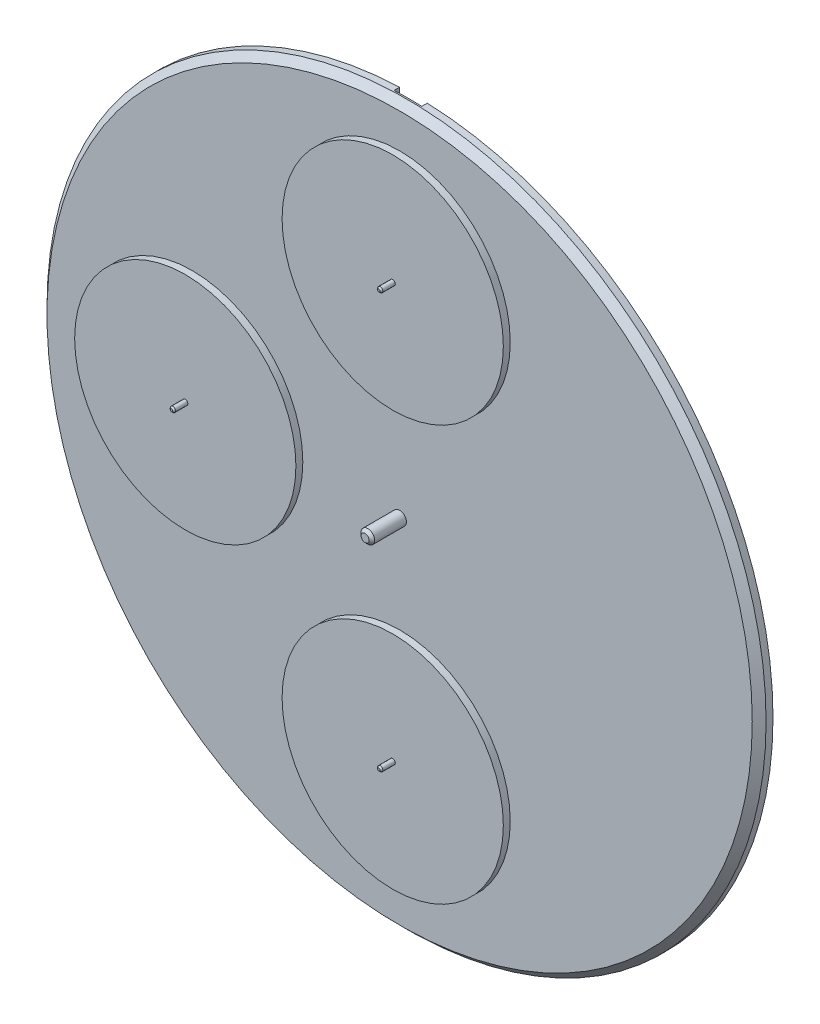
ISO-10303-21;
HEADER;
FILE_DESCRIPTION(('STEP AP214'),'2;1');
FILE_NAME('part.step','',(''),(''),'','','');
FILE_SCHEMA(('AUTOMOTIVE_DESIGN { 1 0 10303 214 1 1 1 1 }'));
ENDSEC;
DATA;
#1=APPLICATION_CONTEXT('core data for automotive mechanical design processes');
#2=APPLICATION_PROTOCOL_DEFINITION('international standard','automotive_design',2000,#1);
#3=PRODUCT_CONTEXT('',#1,'mechanical');
#4=PRODUCT('Part','Part','',(#3));
#5=PRODUCT_RELATED_PRODUCT_CATEGORY('part','',(#4));
#6=PRODUCT_DEFINITION_FORMATION('','',#4);
#7=PRODUCT_DEFINITION_CONTEXT('part definition',#1,'design');
#8=PRODUCT_DEFINITION('design','',#6,#7);
#9=PRODUCT_DEFINITION_SHAPE('','',#8);
#10=(LENGTH_UNIT() NAMED_UNIT(*) SI_UNIT(.MILLI.,.METRE.));
#11=(NAMED_UNIT(*) PLANE_ANGLE_UNIT() SI_UNIT($,.RADIAN.));
#12=(NAMED_UNIT(*) SI_UNIT($,.STERADIAN.) SOLID_ANGLE_UNIT());
#13=UNCERTAINTY_MEASURE_WITH_UNIT(LENGTH_MEASURE(1.E-05),#10,'distance_accuracy_value','');
#14=(GEOMETRIC_REPRESENTATION_CONTEXT(3) GLOBAL_UNCERTAINTY_ASSIGNED_CONTEXT((#13)) GLOBAL_UNIT_ASSIGNED_CONTEXT((#10,
#11,#12)) REPRESENTATION_CONTEXT('',''));
#15=CARTESIAN_POINT('',(0.,0.,0.));
#16=DIRECTION('',(0.,0.,1.));
#17=DIRECTION('',(1.,0.,0.));
#18=AXIS2_PLACEMENT_3D('',#15,#16,#17);
#19=CARTESIAN_POINT('',(0.,0.,0.));
#20=DIRECTION('',(0.,0.,1.));
#21=DIRECTION('',(1.,0.,0.));
#22=AXIS2_PLACEMENT_3D('',#19,#20,#21);
#23=PLANE('',#22);
#24=CARTESIAN_POINT('',(0.,0.,0.));
#25=DIRECTION('',(0.,0.,1.));
#26=DIRECTION('',(1.,0.,0.));
#27=AXIS2_PLACEMENT_3D('',#24,#25,#26);
#28=CIRCLE('',#27,12.75);
#29=CARTESIAN_POINT('',(12.75,0.,0.));
#30=VERTEX_POINT('',#29);
#31=EDGE_CURVE('E49',#30,#30,#28,.T.);
#32=ORIENTED_EDGE('',*,*,#31,.T.);
#33=EDGE_LOOP('',(#32));
#34=FACE_BOUND('',#33,.T.);
#35=CARTESIAN_POINT('',(0.,-7.5,0.));
#36=DIRECTION('',(0.,0.,1.));
#37=DIRECTION('',(1.,0.,0.));
#38=AXIS2_PLACEMENT_3D('',#35,#36,#37);
#39=CIRCLE('',#38,4.);
#40=CARTESIAN_POINT('',(4.,-7.5,0.));
#41=VERTEX_POINT('',#40);
#42=EDGE_CURVE('E120',#41,#41,#39,.T.);
#43=ORIENTED_EDGE('',*,*,#42,.F.);
#44=EDGE_LOOP('',(#43));
#45=FACE_BOUND('',#44,.T.);
#46=CARTESIAN_POINT('',(-7.5,0.,0.));
#47=DIRECTION('',(0.,0.,1.));
#48=DIRECTION('',(1.,0.,0.));
#49=AXIS2_PLACEMENT_3D('',#46,#47,#48);
#50=CIRCLE('',#49,4.);
#51=CARTESIAN_POINT('',(-3.5,0.,0.));
#52=VERTEX_POINT('',#51);
#53=EDGE_CURVE('E127',#52,#52,#50,.T.);
#54=ORIENTED_EDGE('',*,*,#53,.F.);
#55=EDGE_LOOP('',(#54));
#56=FACE_BOUND('',#55,.T.);
#57=CARTESIAN_POINT('',(0.,7.5,0.));
#58=DIRECTION('',(0.,0.,1.));
#59=DIRECTION('',(1.,0.,0.));
#60=AXIS2_PLACEMENT_3D('',#57,#58,#59);
#61=CIRCLE('',#60,4.);
#62=CARTESIAN_POINT('',(4.,7.5,0.));
#63=VERTEX_POINT('',#62);
#64=EDGE_CURVE('E119',#63,#63,#61,.T.);
#65=ORIENTED_EDGE('',*,*,#64,.F.);
#66=EDGE_LOOP('',(#65));
#67=FACE_BOUND('',#66,.T.);
#68=CARTESIAN_POINT('',(0.,0.,0.));
#69=DIRECTION('',(0.,0.,1.));
#70=DIRECTION('',(1.,0.,0.));
#71=AXIS2_PLACEMENT_3D('',#68,#69,#70);
#72=CIRCLE('',#71,0.245);
#73=CARTESIAN_POINT('',(0.245,0.,0.));
#74=VERTEX_POINT('',#73);
#75=EDGE_CURVE('E112',#74,#74,#72,.T.);
#76=ORIENTED_EDGE('',*,*,#75,.F.);
#77=EDGE_LOOP('',(#76));
#78=FACE_BOUND('',#77,.T.);
#79=ADVANCED_FACE('F41',(#34,#45,#56,#67,#78),#23,.T.);
#80=CARTESIAN_POINT('',(0.,-7.5,0.25));
#81=DIRECTION('',(0.,0.,1.));
#82=DIRECTION('',(1.,0.,0.));
#83=AXIS2_PLACEMENT_3D('',#80,#81,#82);
#84=PLANE('',#83);
#85=CARTESIAN_POINT('',(0.,-7.5,0.25));
#86=DIRECTION('',(0.,0.,1.));
#87=DIRECTION('',(1.,0.,0.));
#88=AXIS2_PLACEMENT_3D('',#85,#86,#87);
#89=CIRCLE('',#88,4.);
#90=CARTESIAN_POINT('',(4.,-7.5,0.25));
#91=VERTEX_POINT('',#90);
#92=EDGE_CURVE('E116',#91,#91,#89,.T.);
#93=ORIENTED_EDGE('',*,*,#92,.T.);
#94=EDGE_LOOP('',(#93));
#95=FACE_BOUND('',#94,.T.);
#96=CARTESIAN_POINT('',(0.,-7.5,0.25));
#97=DIRECTION('',(0.,0.,1.));
#98=DIRECTION('',(1.,0.,0.));
#99=AXIS2_PLACEMENT_3D('',#96,#97,#98);
#100=CIRCLE('',#99,0.0937500000000001);
#101=CARTESIAN_POINT('',(0.0937500000000036,-7.5,0.25));
#102=VERTEX_POINT('',#101);
#103=EDGE_CURVE('E115',#102,#102,#100,.F.);
#104=ORIENTED_EDGE('',*,*,#103,.T.);
#105=EDGE_LOOP('',(#104));
#106=FACE_BOUND('',#105,.T.);
#107=ADVANCED_FACE('F186',(#95,#106),#84,.T.);
#108=CARTESIAN_POINT('',(0.,7.5,0.25));
#109=DIRECTION('',(0.,0.,1.));
#110=DIRECTION('',(1.,0.,0.));
#111=AXIS2_PLACEMENT_3D('',#108,#109,#110);
#112=PLANE('',#111);
#113=CARTESIAN_POINT('',(0.,7.5,0.25));
#114=DIRECTION('',(0.,0.,1.));
#115=DIRECTION('',(1.,0.,0.));
#116=AXIS2_PLACEMENT_3D('',#113,#114,#115);
#117=CIRCLE('',#116,4.);
#118=CARTESIAN_POINT('',(4.,7.5,0.25));
#119=VERTEX_POINT('',#118);
#120=EDGE_CURVE('E124',#119,#119,#117,.T.);
#121=ORIENTED_EDGE('',*,*,#120,.T.);
#122=EDGE_LOOP('',(#121));
#123=FACE_BOUND('',#122,.T.);
#124=CARTESIAN_POINT('',(0.,7.5,0.25));
#125=DIRECTION('',(0.,0.,1.));
#126=DIRECTION('',(1.,0.,0.));
#127=AXIS2_PLACEMENT_3D('',#124,#125,#126);
#128=CIRCLE('',#127,0.0937500000000001);
#129=CARTESIAN_POINT('',(0.0937500000000001,7.5,0.25));
#130=VERTEX_POINT('',#129);
#131=EDGE_CURVE('E140',#130,#130,#128,.F.);
#132=ORIENTED_EDGE('',*,*,#131,.T.);
#133=EDGE_LOOP('',(#132));
#134=FACE_BOUND('',#133,.T.);
#135=ADVANCED_FACE('F191',(#123,#134),#112,.T.);
#136=CARTESIAN_POINT('',(-7.5,0.,0.25));
#137=DIRECTION('',(0.,0.,1.));
#138=DIRECTION('',(1.,0.,0.));
#139=AXIS2_PLACEMENT_3D('',#136,#137,#138);
#140=PLANE('',#139);
#141=CARTESIAN_POINT('',(-7.5,0.,0.25));
#142=DIRECTION('',(0.,0.,1.));
#143=DIRECTION('',(1.,0.,0.));
#144=AXIS2_PLACEMENT_3D('',#141,#142,#143);
#145=CIRCLE('',#144,4.);
#146=CARTESIAN_POINT('',(-3.5,0.,0.25));
#147=VERTEX_POINT('',#146);
#148=EDGE_CURVE('E130',#147,#147,#145,.T.);
#149=ORIENTED_EDGE('',*,*,#148,.T.);
#150=EDGE_LOOP('',(#149));
#151=FACE_BOUND('',#150,.T.);
#152=CARTESIAN_POINT('',(-7.5,0.,0.25));
#153=DIRECTION('',(0.,0.,1.));
#154=DIRECTION('',(1.,0.,0.));
#155=AXIS2_PLACEMENT_3D('',#152,#153,#154);
#156=CIRCLE('',#155,0.0937499999999998);
#157=CARTESIAN_POINT('',(-7.40625,0.,0.25));
#158=VERTEX_POINT('',#157);
#159=EDGE_CURVE('E123',#158,#158,#156,.F.);
#160=ORIENTED_EDGE('',*,*,#159,.T.);
#161=EDGE_LOOP('',(#160));
#162=FACE_BOUND('',#161,.T.);
#163=ADVANCED_FACE('F200',(#151,#162),#140,.T.);
#164=CARTESIAN_POINT('',(0.,0.,-0.5));
#165=DIRECTION('',(0.,0.,1.));
#166=DIRECTION('',(1.,0.,0.));
#167=AXIS2_PLACEMENT_3D('',#164,#165,#166);
#168=CYLINDRICAL_SURFACE('',#167,13.);
#169=CARTESIAN_POINT('',(0.,0.,-0.250000000000002));
#170=DIRECTION('',(0.,0.,1.));
#171=DIRECTION('',(1.,0.,0.));
#172=AXIS2_PLACEMENT_3D('',#169,#170,#171);
#173=CIRCLE('',#172,13.);
#174=CARTESIAN_POINT('',(13.,0.,-0.250000000000002));
#175=VERTEX_POINT('',#174);
#176=EDGE_CURVE('E11',#175,#175,#173,.F.);
#177=ORIENTED_EDGE('',*,*,#176,.T.);
#178=EDGE_LOOP('',(#177));
#179=FACE_BOUND('',#178,.T.);
#180=DIRECTION('',(0.,0.,1.));
#181=VECTOR('',#180,1.);
#182=CARTESIAN_POINT('',(-0.5,12.9903810567666,-0.5));
#183=LINE('',#182,#181);
#184=CARTESIAN_POINT('',(-0.5,12.9903810567666,-0.5));
#185=VERTEX_POINT('',#184);
#186=CARTESIAN_POINT('',(-0.5,12.9903810567666,-0.3));
#187=VERTEX_POINT('',#186);
#188=EDGE_CURVE('E64',#185,#187,#183,.T.);
#189=ORIENTED_EDGE('',*,*,#188,.F.);
#190=CARTESIAN_POINT('',(0.,0.,-0.5));
#191=DIRECTION('',(0.,0.,1.));
#192=DIRECTION('',(1.,0.,0.));
#193=AXIS2_PLACEMENT_3D('',#190,#191,#192);
#194=CIRCLE('',#193,13.);
#195=CARTESIAN_POINT('',(0.5,12.9903810567666,-0.5));
#196=VERTEX_POINT('',#195);
#197=EDGE_CURVE('E133',#185,#196,#194,.T.);
#198=ORIENTED_EDGE('',*,*,#197,.T.);
#199=DIRECTION('',(0.,0.,1.));
#200=VECTOR('',#199,1.);
#201=CARTESIAN_POINT('',(0.5,12.9903810567666,-0.5));
#202=LINE('',#201,#200);
#203=CARTESIAN_POINT('',(0.5,12.9903810567666,-0.3));
#204=VERTEX_POINT('',#203);
#205=EDGE_CURVE('E56',#204,#196,#202,.F.);
#206=ORIENTED_EDGE('',*,*,#205,.F.);
#207=CARTESIAN_POINT('',(0.,0.,-0.3));
#208=DIRECTION('',(0.,0.,-1.));
#209=DIRECTION('',(-1.,0.,0.));
#210=AXIS2_PLACEMENT_3D('',#207,#208,#209);
#211=CIRCLE('',#210,13.);
#212=EDGE_CURVE('E89',#204,#187,#211,.F.);
#213=ORIENTED_EDGE('',*,*,#212,.T.);
#214=EDGE_LOOP('',(#189,#198,#206,#213));
#215=FACE_BOUND('',#214,.T.);
#216=ADVANCED_FACE('F198',(#179,#215),#168,.T.);
#217=CARTESIAN_POINT('',(0.,0.,-0.5));
#218=DIRECTION('',(0.,0.,1.));
#219=DIRECTION('',(1.,0.,0.));
#220=AXIS2_PLACEMENT_3D('',#217,#218,#219);
#221=PLANE('',#220);
#222=ORIENTED_EDGE('',*,*,#197,.F.);
#223=DIRECTION('',(0.,1.,0.));
#224=VECTOR('',#223,1.);
#225=CARTESIAN_POINT('',(-0.5,12.,-0.5));
#226=LINE('',#225,#224);
#227=CARTESIAN_POINT('',(-0.5,12.,-0.5));
#228=VERTEX_POINT('',#227);
#229=EDGE_CURVE('E105',#228,#185,#226,.T.);
#230=ORIENTED_EDGE('',*,*,#229,.F.);
#231=DIRECTION('',(-1.,0.,0.));
#232=VECTOR('',#231,1.);
#233=CARTESIAN_POINT('',(-0.5,12.,-0.5));
#234=LINE('',#233,#232);
#235=CARTESIAN_POINT('',(0.5,12.,-0.5));
#236=VERTEX_POINT('',#235);
#237=EDGE_CURVE('E107',#236,#228,#234,.T.);
#238=ORIENTED_EDGE('',*,*,#237,.F.);
#239=DIRECTION('',(0.,1.,0.));
#240=VECTOR('',#239,1.);
#241=CARTESIAN_POINT('',(0.5,0.,-0.5));
#242=LINE('',#241,#240);
#243=EDGE_CURVE('E95',#236,#196,#242,.T.);
#244=ORIENTED_EDGE('',*,*,#243,.T.);
#245=EDGE_LOOP('',(#222,#230,#238,#244));
#246=FACE_BOUND('',#245,.T.);
#247=ADVANCED_FACE('F196',(#246),#221,.F.);
#248=CARTESIAN_POINT('',(-7.5,0.,0.25));
#249=DIRECTION('',(0.,0.,-1.));
#250=DIRECTION('',(-1.,0.,0.));
#251=AXIS2_PLACEMENT_3D('',#248,#249,#250);
#252=CYLINDRICAL_SURFACE('',#251,4.);
#253=ORIENTED_EDGE('',*,*,#148,.F.);
#254=EDGE_LOOP('',(#253));
#255=FACE_BOUND('',#254,.T.);
#256=ORIENTED_EDGE('',*,*,#53,.T.);
#257=EDGE_LOOP('',(#256));
#258=FACE_BOUND('',#257,.T.);
#259=ADVANCED_FACE('F260',(#255,#258),#252,.T.);
#260=CARTESIAN_POINT('',(0.,7.5,0.25));
#261=DIRECTION('',(0.,0.,-1.));
#262=DIRECTION('',(-1.,0.,0.));
#263=AXIS2_PLACEMENT_3D('',#260,#261,#262);
#264=CYLINDRICAL_SURFACE('',#263,4.);
#265=ORIENTED_EDGE('',*,*,#120,.F.);
#266=EDGE_LOOP('',(#265));
#267=FACE_BOUND('',#266,.T.);
#268=ORIENTED_EDGE('',*,*,#64,.T.);
#269=EDGE_LOOP('',(#268));
#270=FACE_BOUND('',#269,.T.);
#271=ADVANCED_FACE('F253',(#267,#270),#264,.T.);
#272=CARTESIAN_POINT('',(0.,-7.5,0.25));
#273=DIRECTION('',(0.,0.,-1.));
#274=DIRECTION('',(-1.,0.,0.));
#275=AXIS2_PLACEMENT_3D('',#272,#273,#274);
#276=CYLINDRICAL_SURFACE('',#275,4.);
#277=ORIENTED_EDGE('',*,*,#92,.F.);
#278=EDGE_LOOP('',(#277));
#279=FACE_BOUND('',#278,.T.);
#280=ORIENTED_EDGE('',*,*,#42,.T.);
#281=EDGE_LOOP('',(#280));
#282=FACE_BOUND('',#281,.T.);
#283=ADVANCED_FACE('F248',(#279,#282),#276,.T.);
#284=CARTESIAN_POINT('',(-7.5,0.,0.75));
#285=DIRECTION('',(0.,0.,-1.));
#286=DIRECTION('',(-1.,0.,0.));
#287=AXIS2_PLACEMENT_3D('',#284,#285,#286);
#288=CYLINDRICAL_SURFACE('',#287,0.0937499999999998);
#289=CARTESIAN_POINT('',(-7.5,0.,0.7));
#290=DIRECTION('',(0.,0.,1.));
#291=DIRECTION('',(1.,0.,0.));
#292=AXIS2_PLACEMENT_3D('',#289,#290,#291);
#293=CIRCLE('',#292,0.0937499999999998);
#294=CARTESIAN_POINT('',(-7.40625,0.,0.7));
#295=VERTEX_POINT('',#294);
#296=EDGE_CURVE('E168',#295,#295,#293,.F.);
#297=ORIENTED_EDGE('',*,*,#296,.T.);
#298=EDGE_LOOP('',(#297));
#299=FACE_BOUND('',#298,.T.);
#300=ORIENTED_EDGE('',*,*,#159,.F.);
#301=EDGE_LOOP('',(#300));
#302=FACE_BOUND('',#301,.T.);
#303=ADVANCED_FACE('F245',(#299,#302),#288,.T.);
#304=CARTESIAN_POINT('',(-7.5,0.,0.75));
#305=DIRECTION('',(0.,0.,1.));
#306=DIRECTION('',(1.,0.,0.));
#307=AXIS2_PLACEMENT_3D('',#304,#305,#306);
#308=PLANE('',#307);
#309=CARTESIAN_POINT('',(-7.5,0.,0.75));
#310=DIRECTION('',(0.,0.,1.));
#311=DIRECTION('',(1.,0.,0.));
#312=AXIS2_PLACEMENT_3D('',#309,#310,#311);
#313=CIRCLE('',#312,0.0437499999999995);
#314=CARTESIAN_POINT('',(-7.45625,0.,0.75));
#315=VERTEX_POINT('',#314);
#316=EDGE_CURVE('E165',#315,#315,#313,.T.);
#317=ORIENTED_EDGE('',*,*,#316,.T.);
#318=EDGE_LOOP('',(#317));
#319=FACE_BOUND('',#318,.T.);
#320=ADVANCED_FACE('F241',(#319),#308,.T.);
#321=CARTESIAN_POINT('',(0.,7.5,0.75));
#322=DIRECTION('',(0.,0.,-1.));
#323=DIRECTION('',(-1.,0.,0.));
#324=AXIS2_PLACEMENT_3D('',#321,#322,#323);
#325=CYLINDRICAL_SURFACE('',#324,0.0937500000000001);
#326=CARTESIAN_POINT('',(0.,7.5,0.7));
#327=DIRECTION('',(0.,0.,1.));
#328=DIRECTION('',(1.,0.,0.));
#329=AXIS2_PLACEMENT_3D('',#326,#327,#328);
#330=CIRCLE('',#329,0.0937500000000001);
#331=CARTESIAN_POINT('',(0.0937500000000001,7.5,0.7));
#332=VERTEX_POINT('',#331);
#333=EDGE_CURVE('E156',#332,#332,#330,.F.);
#334=ORIENTED_EDGE('',*,*,#333,.T.);
#335=EDGE_LOOP('',(#334));
#336=FACE_BOUND('',#335,.T.);
#337=ORIENTED_EDGE('',*,*,#131,.F.);
#338=EDGE_LOOP('',(#337));
#339=FACE_BOUND('',#338,.T.);
#340=ADVANCED_FACE('F237',(#336,#339),#325,.T.);
#341=CARTESIAN_POINT('',(0.,7.5,0.75));
#342=DIRECTION('',(0.,0.,1.));
#343=DIRECTION('',(1.,0.,0.));
#344=AXIS2_PLACEMENT_3D('',#341,#342,#343);
#345=PLANE('',#344);
#346=CARTESIAN_POINT('',(0.,7.5,0.75));
#347=DIRECTION('',(0.,0.,1.));
#348=DIRECTION('',(1.,0.,0.));
#349=AXIS2_PLACEMENT_3D('',#346,#347,#348);
#350=CIRCLE('',#349,0.0437500000000001);
#351=CARTESIAN_POINT('',(0.0437500000000001,7.5,0.75));
#352=VERTEX_POINT('',#351);
#353=EDGE_CURVE('E153',#352,#352,#350,.T.);
#354=ORIENTED_EDGE('',*,*,#353,.T.);
#355=EDGE_LOOP('',(#354));
#356=FACE_BOUND('',#355,.T.);
#357=ADVANCED_FACE('F230',(#356),#345,.T.);
#358=CARTESIAN_POINT('',(0.,-7.5,0.75));
#359=DIRECTION('',(0.,0.,-1.));
#360=DIRECTION('',(-1.,0.,0.));
#361=AXIS2_PLACEMENT_3D('',#358,#359,#360);
#362=CYLINDRICAL_SURFACE('',#361,0.0937500000000001);
#363=CARTESIAN_POINT('',(0.,-7.5,0.7));
#364=DIRECTION('',(0.,0.,1.));
#365=DIRECTION('',(1.,0.,0.));
#366=AXIS2_PLACEMENT_3D('',#363,#364,#365);
#367=CIRCLE('',#366,0.0937500000000001);
#368=CARTESIAN_POINT('',(0.0937500000000036,-7.5,0.7));
#369=VERTEX_POINT('',#368);
#370=EDGE_CURVE('E162',#369,#369,#367,.F.);
#371=ORIENTED_EDGE('',*,*,#370,.T.);
#372=EDGE_LOOP('',(#371));
#373=FACE_BOUND('',#372,.T.);
#374=ORIENTED_EDGE('',*,*,#103,.F.);
#375=EDGE_LOOP('',(#374));
#376=FACE_BOUND('',#375,.T.);
#377=ADVANCED_FACE('F221',(#373,#376),#362,.T.);
#378=CARTESIAN_POINT('',(0.,-7.5,0.75));
#379=DIRECTION('',(0.,0.,1.));
#380=DIRECTION('',(1.,0.,0.));
#381=AXIS2_PLACEMENT_3D('',#378,#379,#380);
#382=PLANE('',#381);
#383=CARTESIAN_POINT('',(0.,-7.5,0.75));
#384=DIRECTION('',(0.,0.,1.));
#385=DIRECTION('',(1.,0.,0.));
#386=AXIS2_PLACEMENT_3D('',#383,#384,#385);
#387=CIRCLE('',#386,0.0437500000000001);
#388=CARTESIAN_POINT('',(0.0437500000000035,-7.5,0.75));
#389=VERTEX_POINT('',#388);
#390=EDGE_CURVE('E159',#389,#389,#387,.T.);
#391=ORIENTED_EDGE('',*,*,#390,.T.);
#392=EDGE_LOOP('',(#391));
#393=FACE_BOUND('',#392,.T.);
#394=ADVANCED_FACE('F218',(#393),#382,.T.);
#395=CARTESIAN_POINT('',(0.,0.,1.25));
#396=DIRECTION('',(0.,0.,-1.));
#397=DIRECTION('',(-1.,0.,0.));
#398=AXIS2_PLACEMENT_3D('',#395,#396,#397);
#399=CYLINDRICAL_SURFACE('',#398,0.245);
#400=CARTESIAN_POINT('',(0.,0.,1.15));
#401=DIRECTION('',(0.,0.,1.));
#402=DIRECTION('',(1.,0.,0.));
#403=AXIS2_PLACEMENT_3D('',#400,#401,#402);
#404=CIRCLE('',#403,0.245);
#405=CARTESIAN_POINT('',(0.245,0.,1.15));
#406=VERTEX_POINT('',#405);
#407=EDGE_CURVE('E150',#406,#406,#404,.F.);
#408=ORIENTED_EDGE('',*,*,#407,.T.);
#409=EDGE_LOOP('',(#408));
#410=FACE_BOUND('',#409,.T.);
#411=ORIENTED_EDGE('',*,*,#75,.T.);
#412=EDGE_LOOP('',(#411));
#413=FACE_BOUND('',#412,.T.);
#414=ADVANCED_FACE('F220',(#410,#413),#399,.T.);
#415=CARTESIAN_POINT('',(0.,0.,1.25));
#416=DIRECTION('',(0.,0.,1.));
#417=DIRECTION('',(1.,0.,0.));
#418=AXIS2_PLACEMENT_3D('',#415,#416,#417);
#419=PLANE('',#418);
#420=CARTESIAN_POINT('',(0.,0.,1.25));
#421=DIRECTION('',(0.,0.,1.));
#422=DIRECTION('',(1.,0.,0.));
#423=AXIS2_PLACEMENT_3D('',#420,#421,#422);
#424=CIRCLE('',#423,0.145);
#425=CARTESIAN_POINT('',(0.145,0.,1.25));
#426=VERTEX_POINT('',#425);
#427=EDGE_CURVE('E147',#426,#426,#424,.T.);
#428=ORIENTED_EDGE('',*,*,#427,.T.);
#429=EDGE_LOOP('',(#428));
#430=FACE_BOUND('',#429,.T.);
#431=ADVANCED_FACE('F227',(#430),#419,.T.);
#432=CARTESIAN_POINT('',(-0.5,12.,-0.3));
#433=DIRECTION('',(-1.,0.,0.));
#434=DIRECTION('',(0.,0.,1.));
#435=AXIS2_PLACEMENT_3D('',#432,#433,#434);
#436=PLANE('',#435);
#437=ORIENTED_EDGE('',*,*,#188,.T.);
#438=DIRECTION('',(0.,1.,0.));
#439=VECTOR('',#438,1.);
#440=CARTESIAN_POINT('',(-0.5,12.,-0.3));
#441=LINE('',#440,#439);
#442=CARTESIAN_POINT('',(-0.5,12.,-0.3));
#443=VERTEX_POINT('',#442);
#444=EDGE_CURVE('E90',#443,#187,#441,.T.);
#445=ORIENTED_EDGE('',*,*,#444,.F.);
#446=DIRECTION('',(0.,0.,-1.));
#447=VECTOR('',#446,1.);
#448=CARTESIAN_POINT('',(-0.5,12.,-0.3));
#449=LINE('',#448,#447);
#450=EDGE_CURVE('E99',#443,#228,#449,.T.);
#451=ORIENTED_EDGE('',*,*,#450,.T.);
#452=ORIENTED_EDGE('',*,*,#229,.T.);
#453=EDGE_LOOP('',(#437,#445,#451,#452));
#454=FACE_BOUND('',#453,.T.);
#455=ADVANCED_FACE('F289',(#454),#436,.F.);
#456=CARTESIAN_POINT('',(-0.5,12.,-0.3));
#457=DIRECTION('',(0.,-1.,0.));
#458=DIRECTION('',(0.,0.,-1.));
#459=AXIS2_PLACEMENT_3D('',#456,#457,#458);
#460=PLANE('',#459);
#461=ORIENTED_EDGE('',*,*,#237,.T.);
#462=ORIENTED_EDGE('',*,*,#450,.F.);
#463=DIRECTION('',(-1.,0.,0.));
#464=VECTOR('',#463,1.);
#465=CARTESIAN_POINT('',(-0.5,12.,-0.3));
#466=LINE('',#465,#464);
#467=CARTESIAN_POINT('',(0.5,12.,-0.3));
#468=VERTEX_POINT('',#467);
#469=EDGE_CURVE('E87',#468,#443,#466,.T.);
#470=ORIENTED_EDGE('',*,*,#469,.F.);
#471=DIRECTION('',(0.,0.,-1.));
#472=VECTOR('',#471,1.);
#473=CARTESIAN_POINT('',(0.5,12.,-0.3));
#474=LINE('',#473,#472);
#475=EDGE_CURVE('E93',#468,#236,#474,.T.);
#476=ORIENTED_EDGE('',*,*,#475,.T.);
#477=EDGE_LOOP('',(#461,#462,#470,#476));
#478=FACE_BOUND('',#477,.T.);
#479=ADVANCED_FACE('F101',(#478),#460,.F.);
#480=CARTESIAN_POINT('',(0.5,12.,-0.3));
#481=DIRECTION('',(1.,0.,0.));
#482=DIRECTION('',(0.,0.,-1.));
#483=AXIS2_PLACEMENT_3D('',#480,#481,#482);
#484=PLANE('',#483);
#485=ORIENTED_EDGE('',*,*,#205,.T.);
#486=ORIENTED_EDGE('',*,*,#243,.F.);
#487=ORIENTED_EDGE('',*,*,#475,.F.);
#488=DIRECTION('',(0.,-1.,0.));
#489=VECTOR('',#488,1.);
#490=CARTESIAN_POINT('',(0.5,12.,-0.3));
#491=LINE('',#490,#489);
#492=EDGE_CURVE('E83',#204,#468,#491,.T.);
#493=ORIENTED_EDGE('',*,*,#492,.F.);
#494=EDGE_LOOP('',(#485,#486,#487,#493));
#495=FACE_BOUND('',#494,.T.);
#496=ADVANCED_FACE('F94',(#495),#484,.F.);
#497=CARTESIAN_POINT('',(-0.5,14.,-0.3));
#498=DIRECTION('',(0.,0.,-1.));
#499=DIRECTION('',(-1.,0.,0.));
#500=AXIS2_PLACEMENT_3D('',#497,#498,#499);
#501=PLANE('',#500);
#502=ORIENTED_EDGE('',*,*,#492,.T.);
#503=ORIENTED_EDGE('',*,*,#469,.T.);
#504=ORIENTED_EDGE('',*,*,#444,.T.);
#505=ORIENTED_EDGE('',*,*,#212,.F.);
#506=EDGE_LOOP('',(#502,#503,#504,#505));
#507=FACE_BOUND('',#506,.T.);
#508=ADVANCED_FACE('F85',(#507),#501,.T.);
#509=CARTESIAN_POINT('',(0.,0.,1.25));
#510=DIRECTION('',(0.,0.,-1.));
#511=DIRECTION('',(-1.,0.,0.));
#512=AXIS2_PLACEMENT_3D('',#509,#510,#511);
#513=CONICAL_SURFACE('',#512,0.145,0.785398163397447);
#514=ORIENTED_EDGE('',*,*,#407,.F.);
#515=EDGE_LOOP('',(#514));
#516=FACE_BOUND('',#515,.T.);
#517=ORIENTED_EDGE('',*,*,#427,.F.);
#518=EDGE_LOOP('',(#517));
#519=FACE_BOUND('',#518,.T.);
#520=ADVANCED_FACE('F202',(#516,#519),#513,.T.);
#521=CARTESIAN_POINT('',(0.,7.5,0.75));
#522=DIRECTION('',(0.,0.,-1.));
#523=DIRECTION('',(-1.,0.,0.));
#524=AXIS2_PLACEMENT_3D('',#521,#522,#523);
#525=CONICAL_SURFACE('',#524,0.0437500000000001,0.785398163397446);
#526=ORIENTED_EDGE('',*,*,#333,.F.);
#527=EDGE_LOOP('',(#526));
#528=FACE_BOUND('',#527,.T.);
#529=ORIENTED_EDGE('',*,*,#353,.F.);
#530=EDGE_LOOP('',(#529));
#531=FACE_BOUND('',#530,.T.);
#532=ADVANCED_FACE('F205',(#528,#531),#525,.T.);
#533=CARTESIAN_POINT('',(0.,-7.5,0.75));
#534=DIRECTION('',(0.,0.,-1.));
#535=DIRECTION('',(-1.,0.,0.));
#536=AXIS2_PLACEMENT_3D('',#533,#534,#535);
#537=CONICAL_SURFACE('',#536,0.0437500000000001,0.785398163397446);
#538=ORIENTED_EDGE('',*,*,#370,.F.);
#539=EDGE_LOOP('',(#538));
#540=FACE_BOUND('',#539,.T.);
#541=ORIENTED_EDGE('',*,*,#390,.F.);
#542=EDGE_LOOP('',(#541));
#543=FACE_BOUND('',#542,.T.);
#544=ADVANCED_FACE('F182',(#540,#543),#537,.T.);
#545=CARTESIAN_POINT('',(-7.5,0.,0.75));
#546=DIRECTION('',(0.,0.,-1.));
#547=DIRECTION('',(-1.,0.,0.));
#548=AXIS2_PLACEMENT_3D('',#545,#546,#547);
#549=CONICAL_SURFACE('',#548,0.0437499999999995,0.785398163397454);
#550=ORIENTED_EDGE('',*,*,#296,.F.);
#551=EDGE_LOOP('',(#550));
#552=FACE_BOUND('',#551,.T.);
#553=ORIENTED_EDGE('',*,*,#316,.F.);
#554=EDGE_LOOP('',(#553));
#555=FACE_BOUND('',#554,.T.);
#556=ADVANCED_FACE('F176',(#552,#555),#549,.T.);
#557=CARTESIAN_POINT('',(0.,0.,0.));
#558=DIRECTION('',(0.,0.,-1.));
#559=DIRECTION('',(-1.,0.,0.));
#560=AXIS2_PLACEMENT_3D('',#557,#558,#559);
#561=CONICAL_SURFACE('',#560,12.75,0.785398163397445);
#562=ORIENTED_EDGE('',*,*,#176,.F.);
#563=EDGE_LOOP('',(#562));
#564=FACE_BOUND('',#563,.T.);
#565=ORIENTED_EDGE('',*,*,#31,.F.);
#566=EDGE_LOOP('',(#565));
#567=FACE_BOUND('',#566,.T.);
#568=ADVANCED_FACE('F43',(#564,#567),#561,.T.);
#569=CLOSED_SHELL('',(#79,#107,#135,#163,#216,#247,#259,#271,#283,#303,#320,#340,#357,#377,#394,
#414,#431,#455,#479,#496,#508,#520,#532,#544,#556,#568));
#570=MANIFOLD_SOLID_BREP('B2',#569);
#571=ADVANCED_BREP_SHAPE_REPRESENTATION('',(#18,#570),#14);
#572=SHAPE_DEFINITION_REPRESENTATION(#9,#571);
ENDSEC;
END-ISO-10303-21;
